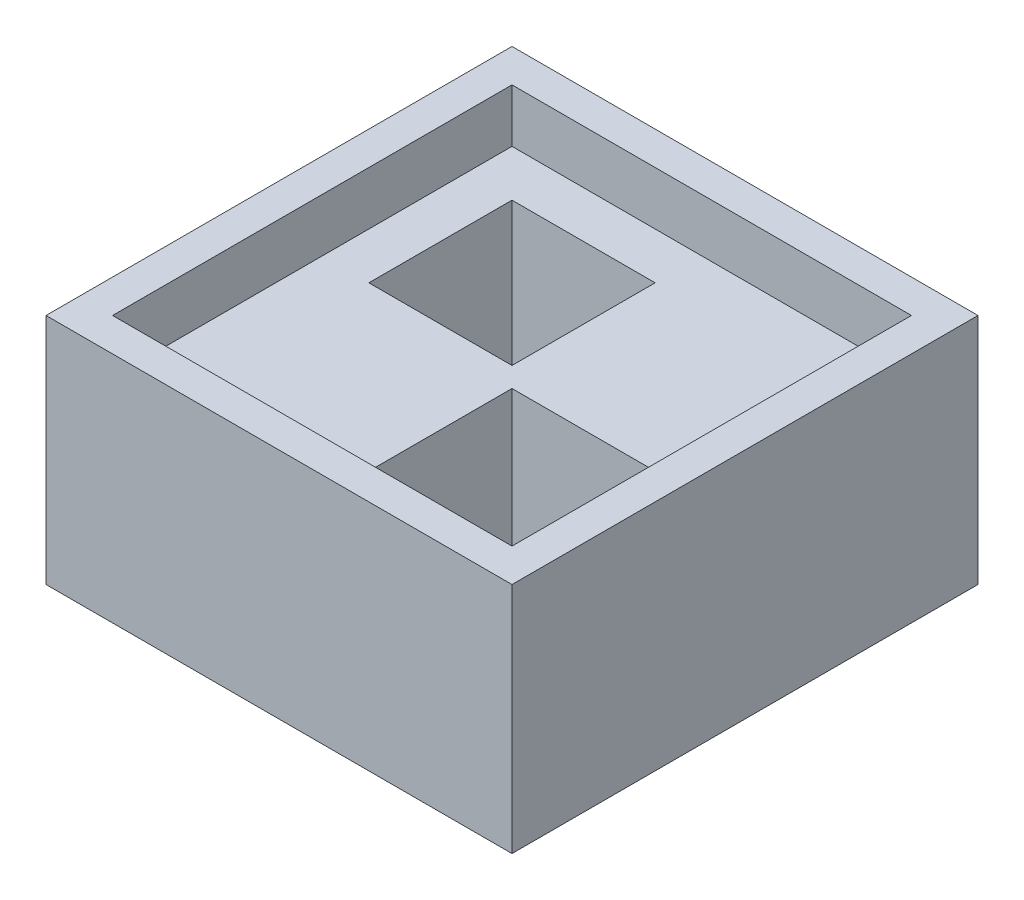
ISO-10303-21;
HEADER;
FILE_DESCRIPTION(('STEP AP214'),'2;1');
FILE_NAME('part.step','',(''),(''),'','','');
FILE_SCHEMA(('AUTOMOTIVE_DESIGN { 1 0 10303 214 1 1 1 1 }'));
ENDSEC;
DATA;
#1=APPLICATION_CONTEXT('core data for automotive mechanical design processes');
#2=APPLICATION_PROTOCOL_DEFINITION('international standard','automotive_design',2000,#1);
#3=PRODUCT_CONTEXT('',#1,'mechanical');
#4=PRODUCT('Part','Part','',(#3));
#5=PRODUCT_RELATED_PRODUCT_CATEGORY('part','',(#4));
#6=PRODUCT_DEFINITION_FORMATION('','',#4);
#7=PRODUCT_DEFINITION_CONTEXT('part definition',#1,'design');
#8=PRODUCT_DEFINITION('design','',#6,#7);
#9=PRODUCT_DEFINITION_SHAPE('','',#8);
#10=(LENGTH_UNIT() NAMED_UNIT(*) SI_UNIT(.MILLI.,.METRE.));
#11=(NAMED_UNIT(*) PLANE_ANGLE_UNIT() SI_UNIT($,.RADIAN.));
#12=(NAMED_UNIT(*) SI_UNIT($,.STERADIAN.) SOLID_ANGLE_UNIT());
#13=UNCERTAINTY_MEASURE_WITH_UNIT(LENGTH_MEASURE(1.E-05),#10,'distance_accuracy_value','');
#14=(GEOMETRIC_REPRESENTATION_CONTEXT(3) GLOBAL_UNCERTAINTY_ASSIGNED_CONTEXT((#13)) GLOBAL_UNIT_ASSIGNED_CONTEXT((#10,
#11,#12)) REPRESENTATION_CONTEXT('',''));
#15=CARTESIAN_POINT('',(0.,0.,0.));
#16=DIRECTION('',(0.,0.,1.));
#17=DIRECTION('',(1.,0.,0.));
#18=AXIS2_PLACEMENT_3D('',#15,#16,#17);
#19=CARTESIAN_POINT('',(0.,35.,0.));
#20=DIRECTION('',(1.,0.,0.));
#21=DIRECTION('',(0.,0.,-1.));
#22=AXIS2_PLACEMENT_3D('',#19,#20,#21);
#23=PLANE('',#22);
#24=DIRECTION('',(0.,0.,1.));
#25=VECTOR('',#24,1.);
#26=CARTESIAN_POINT('',(0.,0.,0.));
#27=LINE('',#26,#25);
#28=CARTESIAN_POINT('',(0.,0.,-70.));
#29=VERTEX_POINT('',#28);
#30=CARTESIAN_POINT('',(0.,0.,0.));
#31=VERTEX_POINT('',#30);
#32=EDGE_CURVE('E239',#29,#31,#27,.T.);
#33=ORIENTED_EDGE('',*,*,#32,.T.);
#34=DIRECTION('',(0.,-1.,0.));
#35=VECTOR('',#34,1.);
#36=CARTESIAN_POINT('',(0.,35.,0.));
#37=LINE('',#36,#35);
#38=CARTESIAN_POINT('',(0.,35.,0.));
#39=VERTEX_POINT('',#38);
#40=EDGE_CURVE('E11',#39,#31,#37,.T.);
#41=ORIENTED_EDGE('',*,*,#40,.F.);
#42=DIRECTION('',(0.,0.,1.));
#43=VECTOR('',#42,1.);
#44=CARTESIAN_POINT('',(0.,35.,0.));
#45=LINE('',#44,#43);
#46=CARTESIAN_POINT('',(0.,35.,-70.));
#47=VERTEX_POINT('',#46);
#48=EDGE_CURVE('E246',#47,#39,#45,.T.);
#49=ORIENTED_EDGE('',*,*,#48,.F.);
#50=DIRECTION('',(0.,-1.,0.));
#51=VECTOR('',#50,1.);
#52=CARTESIAN_POINT('',(0.,35.,-70.));
#53=LINE('',#52,#51);
#54=EDGE_CURVE('E256',#47,#29,#53,.T.);
#55=ORIENTED_EDGE('',*,*,#54,.T.);
#56=EDGE_LOOP('',(#33,#41,#49,#55));
#57=FACE_BOUND('',#56,.T.);
#58=ADVANCED_FACE('F33',(#57),#23,.F.);
#59=CARTESIAN_POINT('',(0.,35.,0.));
#60=DIRECTION('',(0.,0.,-1.));
#61=DIRECTION('',(-1.,0.,0.));
#62=AXIS2_PLACEMENT_3D('',#59,#60,#61);
#63=PLANE('',#62);
#64=DIRECTION('',(1.,0.,0.));
#65=VECTOR('',#64,1.);
#66=CARTESIAN_POINT('',(0.,0.,0.));
#67=LINE('',#66,#65);
#68=CARTESIAN_POINT('',(70.,0.,0.));
#69=VERTEX_POINT('',#68);
#70=EDGE_CURVE('E259',#31,#69,#67,.T.);
#71=ORIENTED_EDGE('',*,*,#70,.T.);
#72=DIRECTION('',(0.,-1.,0.));
#73=VECTOR('',#72,1.);
#74=CARTESIAN_POINT('',(70.,35.,0.));
#75=LINE('',#74,#73);
#76=CARTESIAN_POINT('',(70.,35.,0.));
#77=VERTEX_POINT('',#76);
#78=EDGE_CURVE('E40',#77,#69,#75,.T.);
#79=ORIENTED_EDGE('',*,*,#78,.F.);
#80=DIRECTION('',(1.,0.,0.));
#81=VECTOR('',#80,1.);
#82=CARTESIAN_POINT('',(0.,35.,0.));
#83=LINE('',#82,#81);
#84=EDGE_CURVE('E249',#39,#77,#83,.T.);
#85=ORIENTED_EDGE('',*,*,#84,.F.);
#86=ORIENTED_EDGE('',*,*,#40,.T.);
#87=EDGE_LOOP('',(#71,#79,#85,#86));
#88=FACE_BOUND('',#87,.T.);
#89=ADVANCED_FACE('F289',(#88),#63,.F.);
#90=CARTESIAN_POINT('',(70.,35.,0.));
#91=DIRECTION('',(-1.,0.,0.));
#92=DIRECTION('',(0.,0.,1.));
#93=AXIS2_PLACEMENT_3D('',#90,#91,#92);
#94=PLANE('',#93);
#95=DIRECTION('',(0.,0.,-1.));
#96=VECTOR('',#95,1.);
#97=CARTESIAN_POINT('',(70.,0.,0.));
#98=LINE('',#97,#96);
#99=CARTESIAN_POINT('',(70.,0.,-70.));
#100=VERTEX_POINT('',#99);
#101=EDGE_CURVE('E261',#69,#100,#98,.T.);
#102=ORIENTED_EDGE('',*,*,#101,.T.);
#103=DIRECTION('',(0.,-1.,0.));
#104=VECTOR('',#103,1.);
#105=CARTESIAN_POINT('',(70.,35.,-70.));
#106=LINE('',#105,#104);
#107=CARTESIAN_POINT('',(70.,35.,-70.));
#108=VERTEX_POINT('',#107);
#109=EDGE_CURVE('E266',#108,#100,#106,.T.);
#110=ORIENTED_EDGE('',*,*,#109,.F.);
#111=DIRECTION('',(0.,0.,-1.));
#112=VECTOR('',#111,1.);
#113=CARTESIAN_POINT('',(70.,35.,0.));
#114=LINE('',#113,#112);
#115=EDGE_CURVE('E252',#77,#108,#114,.T.);
#116=ORIENTED_EDGE('',*,*,#115,.F.);
#117=ORIENTED_EDGE('',*,*,#78,.T.);
#118=EDGE_LOOP('',(#102,#110,#116,#117));
#119=FACE_BOUND('',#118,.T.);
#120=ADVANCED_FACE('F273',(#119),#94,.F.);
#121=CARTESIAN_POINT('',(0.,35.,-70.));
#122=DIRECTION('',(0.,0.,1.));
#123=DIRECTION('',(1.,0.,0.));
#124=AXIS2_PLACEMENT_3D('',#121,#122,#123);
#125=PLANE('',#124);
#126=DIRECTION('',(-1.,0.,0.));
#127=VECTOR('',#126,1.);
#128=CARTESIAN_POINT('',(0.,0.,-70.));
#129=LINE('',#128,#127);
#130=EDGE_CURVE('E250',#100,#29,#129,.T.);
#131=ORIENTED_EDGE('',*,*,#130,.T.);
#132=ORIENTED_EDGE('',*,*,#54,.F.);
#133=DIRECTION('',(-1.,0.,0.));
#134=VECTOR('',#133,1.);
#135=CARTESIAN_POINT('',(0.,35.,-70.));
#136=LINE('',#135,#134);
#137=EDGE_CURVE('E254',#108,#47,#136,.T.);
#138=ORIENTED_EDGE('',*,*,#137,.F.);
#139=ORIENTED_EDGE('',*,*,#109,.T.);
#140=EDGE_LOOP('',(#131,#132,#138,#139));
#141=FACE_BOUND('',#140,.T.);
#142=ADVANCED_FACE('F282',(#141),#125,.F.);
#143=CARTESIAN_POINT('',(0.,35.,0.));
#144=DIRECTION('',(0.,-1.,0.));
#145=DIRECTION('',(0.,0.,-1.));
#146=AXIS2_PLACEMENT_3D('',#143,#144,#145);
#147=PLANE('',#146);
#148=DIRECTION('',(1.,0.,0.));
#149=VECTOR('',#148,1.);
#150=CARTESIAN_POINT('',(5.,35.,-5.));
#151=LINE('',#150,#149);
#152=CARTESIAN_POINT('',(5.,35.,-5.));
#153=VERTEX_POINT('',#152);
#154=CARTESIAN_POINT('',(65.,35.,-5.));
#155=VERTEX_POINT('',#154);
#156=EDGE_CURVE('E229',#153,#155,#151,.T.);
#157=ORIENTED_EDGE('',*,*,#156,.F.);
#158=DIRECTION('',(0.,0.,1.));
#159=VECTOR('',#158,1.);
#160=CARTESIAN_POINT('',(5.,35.,-5.));
#161=LINE('',#160,#159);
#162=CARTESIAN_POINT('',(5.,35.,-65.));
#163=VERTEX_POINT('',#162);
#164=EDGE_CURVE('E181',#163,#153,#161,.T.);
#165=ORIENTED_EDGE('',*,*,#164,.F.);
#166=DIRECTION('',(-1.,0.,0.));
#167=VECTOR('',#166,1.);
#168=CARTESIAN_POINT('',(5.,35.,-65.));
#169=LINE('',#168,#167);
#170=CARTESIAN_POINT('',(65.,35.,-65.));
#171=VERTEX_POINT('',#170);
#172=EDGE_CURVE('E218',#171,#163,#169,.T.);
#173=ORIENTED_EDGE('',*,*,#172,.F.);
#174=DIRECTION('',(0.,0.,-1.));
#175=VECTOR('',#174,1.);
#176=CARTESIAN_POINT('',(65.,35.,-5.));
#177=LINE('',#176,#175);
#178=EDGE_CURVE('E232',#155,#171,#177,.T.);
#179=ORIENTED_EDGE('',*,*,#178,.F.);
#180=EDGE_LOOP('',(#157,#165,#173,#179));
#181=FACE_BOUND('',#180,.T.);
#182=ORIENTED_EDGE('',*,*,#48,.T.);
#183=ORIENTED_EDGE('',*,*,#84,.T.);
#184=ORIENTED_EDGE('',*,*,#115,.T.);
#185=ORIENTED_EDGE('',*,*,#137,.T.);
#186=EDGE_LOOP('',(#182,#183,#184,#185));
#187=FACE_BOUND('',#186,.T.);
#188=ADVANCED_FACE('F288',(#181,#187),#147,.F.);
#189=CARTESIAN_POINT('',(0.,0.,0.));
#190=DIRECTION('',(0.,-1.,0.));
#191=DIRECTION('',(0.,0.,-1.));
#192=AXIS2_PLACEMENT_3D('',#189,#190,#191);
#193=PLANE('',#192);
#194=ORIENTED_EDGE('',*,*,#32,.F.);
#195=ORIENTED_EDGE('',*,*,#130,.F.);
#196=ORIENTED_EDGE('',*,*,#101,.F.);
#197=ORIENTED_EDGE('',*,*,#70,.F.);
#198=EDGE_LOOP('',(#194,#195,#196,#197));
#199=FACE_BOUND('',#198,.T.);
#200=ADVANCED_FACE('F279',(#199),#193,.T.);
#201=CARTESIAN_POINT('',(5.,27.,-5.));
#202=DIRECTION('',(-1.,0.,0.));
#203=DIRECTION('',(0.,0.,1.));
#204=AXIS2_PLACEMENT_3D('',#201,#202,#203);
#205=PLANE('',#204);
#206=ORIENTED_EDGE('',*,*,#164,.T.);
#207=DIRECTION('',(0.,1.,0.));
#208=VECTOR('',#207,1.);
#209=CARTESIAN_POINT('',(5.,27.,-5.));
#210=LINE('',#209,#208);
#211=CARTESIAN_POINT('',(5.,27.,-5.));
#212=VERTEX_POINT('',#211);
#213=EDGE_CURVE('E227',#212,#153,#210,.T.);
#214=ORIENTED_EDGE('',*,*,#213,.F.);
#215=DIRECTION('',(0.,0.,1.));
#216=VECTOR('',#215,1.);
#217=CARTESIAN_POINT('',(5.,27.,-5.));
#218=LINE('',#217,#216);
#219=CARTESIAN_POINT('',(5.,27.,-65.));
#220=VERTEX_POINT('',#219);
#221=EDGE_CURVE('E214',#220,#212,#218,.T.);
#222=ORIENTED_EDGE('',*,*,#221,.F.);
#223=DIRECTION('',(0.,1.,0.));
#224=VECTOR('',#223,1.);
#225=CARTESIAN_POINT('',(5.,27.,-65.));
#226=LINE('',#225,#224);
#227=EDGE_CURVE('E237',#220,#163,#226,.T.);
#228=ORIENTED_EDGE('',*,*,#227,.T.);
#229=EDGE_LOOP('',(#206,#214,#222,#228));
#230=FACE_BOUND('',#229,.T.);
#231=ADVANCED_FACE('F301',(#230),#205,.F.);
#232=CARTESIAN_POINT('',(5.,27.,-65.));
#233=DIRECTION('',(0.,0.,-1.));
#234=DIRECTION('',(-1.,0.,0.));
#235=AXIS2_PLACEMENT_3D('',#232,#233,#234);
#236=PLANE('',#235);
#237=ORIENTED_EDGE('',*,*,#172,.T.);
#238=ORIENTED_EDGE('',*,*,#227,.F.);
#239=DIRECTION('',(-1.,0.,0.));
#240=VECTOR('',#239,1.);
#241=CARTESIAN_POINT('',(5.,27.,-65.));
#242=LINE('',#241,#240);
#243=CARTESIAN_POINT('',(65.,27.,-65.));
#244=VERTEX_POINT('',#243);
#245=EDGE_CURVE('E224',#244,#220,#242,.T.);
#246=ORIENTED_EDGE('',*,*,#245,.F.);
#247=DIRECTION('',(0.,1.,0.));
#248=VECTOR('',#247,1.);
#249=CARTESIAN_POINT('',(65.,27.,-65.));
#250=LINE('',#249,#248);
#251=EDGE_CURVE('E240',#244,#171,#250,.T.);
#252=ORIENTED_EDGE('',*,*,#251,.T.);
#253=EDGE_LOOP('',(#237,#238,#246,#252));
#254=FACE_BOUND('',#253,.T.);
#255=ADVANCED_FACE('F307',(#254),#236,.F.);
#256=CARTESIAN_POINT('',(65.,27.,-5.));
#257=DIRECTION('',(1.,0.,0.));
#258=DIRECTION('',(0.,0.,-1.));
#259=AXIS2_PLACEMENT_3D('',#256,#257,#258);
#260=PLANE('',#259);
#261=ORIENTED_EDGE('',*,*,#178,.T.);
#262=ORIENTED_EDGE('',*,*,#251,.F.);
#263=DIRECTION('',(0.,0.,-1.));
#264=VECTOR('',#263,1.);
#265=CARTESIAN_POINT('',(65.,27.,-5.));
#266=LINE('',#265,#264);
#267=CARTESIAN_POINT('',(65.,27.,-5.));
#268=VERTEX_POINT('',#267);
#269=EDGE_CURVE('E221',#268,#244,#266,.T.);
#270=ORIENTED_EDGE('',*,*,#269,.F.);
#271=DIRECTION('',(0.,1.,0.));
#272=VECTOR('',#271,1.);
#273=CARTESIAN_POINT('',(65.,27.,-5.));
#274=LINE('',#273,#272);
#275=EDGE_CURVE('E242',#268,#155,#274,.T.);
#276=ORIENTED_EDGE('',*,*,#275,.T.);
#277=EDGE_LOOP('',(#261,#262,#270,#276));
#278=FACE_BOUND('',#277,.T.);
#279=ADVANCED_FACE('F313',(#278),#260,.F.);
#280=CARTESIAN_POINT('',(5.,27.,-5.));
#281=DIRECTION('',(0.,0.,1.));
#282=DIRECTION('',(1.,0.,0.));
#283=AXIS2_PLACEMENT_3D('',#280,#281,#282);
#284=PLANE('',#283);
#285=ORIENTED_EDGE('',*,*,#156,.T.);
#286=ORIENTED_EDGE('',*,*,#275,.F.);
#287=DIRECTION('',(1.,0.,0.));
#288=VECTOR('',#287,1.);
#289=CARTESIAN_POINT('',(5.,27.,-5.));
#290=LINE('',#289,#288);
#291=EDGE_CURVE('E217',#212,#268,#290,.T.);
#292=ORIENTED_EDGE('',*,*,#291,.F.);
#293=ORIENTED_EDGE('',*,*,#213,.T.);
#294=EDGE_LOOP('',(#285,#286,#292,#293));
#295=FACE_BOUND('',#294,.T.);
#296=ADVANCED_FACE('F309',(#295),#284,.F.);
#297=CARTESIAN_POINT('',(0.,27.,0.));
#298=DIRECTION('',(0.,-1.,0.));
#299=DIRECTION('',(0.,0.,-1.));
#300=AXIS2_PLACEMENT_3D('',#297,#298,#299);
#301=PLANE('',#300);
#302=DIRECTION('',(1.,0.,0.));
#303=VECTOR('',#302,1.);
#304=CARTESIAN_POINT('',(12.,27.,-36.5));
#305=LINE('',#304,#303);
#306=CARTESIAN_POINT('',(12.,27.,-36.5));
#307=VERTEX_POINT('',#306);
#308=CARTESIAN_POINT('',(33.5,27.,-36.5));
#309=VERTEX_POINT('',#308);
#310=EDGE_CURVE('E174',#307,#309,#305,.T.);
#311=ORIENTED_EDGE('',*,*,#310,.F.);
#312=DIRECTION('',(0.,0.,1.));
#313=VECTOR('',#312,1.);
#314=CARTESIAN_POINT('',(12.,27.,-58.));
#315=LINE('',#314,#313);
#316=CARTESIAN_POINT('',(12.,27.,-58.));
#317=VERTEX_POINT('',#316);
#318=EDGE_CURVE('E47',#317,#307,#315,.T.);
#319=ORIENTED_EDGE('',*,*,#318,.F.);
#320=DIRECTION('',(-1.,0.,0.));
#321=VECTOR('',#320,1.);
#322=CARTESIAN_POINT('',(12.,27.,-58.));
#323=LINE('',#322,#321);
#324=CARTESIAN_POINT('',(33.5,27.,-58.));
#325=VERTEX_POINT('',#324);
#326=EDGE_CURVE('E165',#325,#317,#323,.T.);
#327=ORIENTED_EDGE('',*,*,#326,.F.);
#328=DIRECTION('',(0.,0.,-1.));
#329=VECTOR('',#328,1.);
#330=CARTESIAN_POINT('',(33.5,27.,-58.));
#331=LINE('',#330,#329);
#332=EDGE_CURVE('E168',#309,#325,#331,.T.);
#333=ORIENTED_EDGE('',*,*,#332,.F.);
#334=EDGE_LOOP('',(#311,#319,#327,#333));
#335=FACE_BOUND('',#334,.T.);
#336=DIRECTION('',(-1.,0.,0.));
#337=VECTOR('',#336,1.);
#338=CARTESIAN_POINT('',(58.,27.,-33.5));
#339=LINE('',#338,#337);
#340=CARTESIAN_POINT('',(58.,27.,-33.5));
#341=VERTEX_POINT('',#340);
#342=CARTESIAN_POINT('',(36.5,27.,-33.5));
#343=VERTEX_POINT('',#342);
#344=EDGE_CURVE('E200',#341,#343,#339,.T.);
#345=ORIENTED_EDGE('',*,*,#344,.F.);
#346=DIRECTION('',(0.,0.,-1.));
#347=VECTOR('',#346,1.);
#348=CARTESIAN_POINT('',(58.,27.,-12.));
#349=LINE('',#348,#347);
#350=CARTESIAN_POINT('',(58.,27.,-12.));
#351=VERTEX_POINT('',#350);
#352=EDGE_CURVE('E55',#351,#341,#349,.T.);
#353=ORIENTED_EDGE('',*,*,#352,.F.);
#354=DIRECTION('',(1.,0.,0.));
#355=VECTOR('',#354,1.);
#356=CARTESIAN_POINT('',(58.,27.,-12.));
#357=LINE('',#356,#355);
#358=CARTESIAN_POINT('',(36.5,27.,-12.));
#359=VERTEX_POINT('',#358);
#360=EDGE_CURVE('E189',#359,#351,#357,.T.);
#361=ORIENTED_EDGE('',*,*,#360,.F.);
#362=DIRECTION('',(0.,0.,1.));
#363=VECTOR('',#362,1.);
#364=CARTESIAN_POINT('',(36.5,27.,-12.));
#365=LINE('',#364,#363);
#366=EDGE_CURVE('E203',#343,#359,#365,.T.);
#367=ORIENTED_EDGE('',*,*,#366,.F.);
#368=EDGE_LOOP('',(#345,#353,#361,#367));
#369=FACE_BOUND('',#368,.T.);
#370=ORIENTED_EDGE('',*,*,#221,.T.);
#371=ORIENTED_EDGE('',*,*,#291,.T.);
#372=ORIENTED_EDGE('',*,*,#269,.T.);
#373=ORIENTED_EDGE('',*,*,#245,.T.);
#374=EDGE_LOOP('',(#370,#371,#372,#373));
#375=FACE_BOUND('',#374,.T.);
#376=ADVANCED_FACE('F312',(#335,#369,#375),#301,.F.);
#377=CARTESIAN_POINT('',(58.,1.5,-12.));
#378=DIRECTION('',(1.,0.,0.));
#379=DIRECTION('',(0.,0.,-1.));
#380=AXIS2_PLACEMENT_3D('',#377,#378,#379);
#381=PLANE('',#380);
#382=ORIENTED_EDGE('',*,*,#352,.T.);
#383=DIRECTION('',(0.,1.,0.));
#384=VECTOR('',#383,1.);
#385=CARTESIAN_POINT('',(58.,1.5,-33.5));
#386=LINE('',#385,#384);
#387=CARTESIAN_POINT('',(58.,1.5,-33.5));
#388=VERTEX_POINT('',#387);
#389=EDGE_CURVE('E198',#388,#341,#386,.T.);
#390=ORIENTED_EDGE('',*,*,#389,.F.);
#391=DIRECTION('',(0.,0.,-1.));
#392=VECTOR('',#391,1.);
#393=CARTESIAN_POINT('',(58.,1.5,-12.));
#394=LINE('',#393,#392);
#395=CARTESIAN_POINT('',(58.,1.5,-12.));
#396=VERTEX_POINT('',#395);
#397=EDGE_CURVE('E185',#396,#388,#394,.T.);
#398=ORIENTED_EDGE('',*,*,#397,.F.);
#399=DIRECTION('',(0.,1.,0.));
#400=VECTOR('',#399,1.);
#401=CARTESIAN_POINT('',(58.,1.5,-12.));
#402=LINE('',#401,#400);
#403=EDGE_CURVE('E175',#396,#351,#402,.T.);
#404=ORIENTED_EDGE('',*,*,#403,.T.);
#405=EDGE_LOOP('',(#382,#390,#398,#404));
#406=FACE_BOUND('',#405,.T.);
#407=ADVANCED_FACE('F323',(#406),#381,.F.);
#408=CARTESIAN_POINT('',(58.,1.5,-12.));
#409=DIRECTION('',(0.,0.,1.));
#410=DIRECTION('',(1.,0.,0.));
#411=AXIS2_PLACEMENT_3D('',#408,#409,#410);
#412=PLANE('',#411);
#413=ORIENTED_EDGE('',*,*,#360,.T.);
#414=ORIENTED_EDGE('',*,*,#403,.F.);
#415=DIRECTION('',(1.,0.,0.));
#416=VECTOR('',#415,1.);
#417=CARTESIAN_POINT('',(58.,1.5,-12.));
#418=LINE('',#417,#416);
#419=CARTESIAN_POINT('',(36.5,1.5,-12.));
#420=VERTEX_POINT('',#419);
#421=EDGE_CURVE('E195',#420,#396,#418,.T.);
#422=ORIENTED_EDGE('',*,*,#421,.F.);
#423=DIRECTION('',(0.,1.,0.));
#424=VECTOR('',#423,1.);
#425=CARTESIAN_POINT('',(36.5,1.5,-12.));
#426=LINE('',#425,#424);
#427=EDGE_CURVE('E209',#420,#359,#426,.T.);
#428=ORIENTED_EDGE('',*,*,#427,.T.);
#429=EDGE_LOOP('',(#413,#414,#422,#428));
#430=FACE_BOUND('',#429,.T.);
#431=ADVANCED_FACE('F327',(#430),#412,.F.);
#432=CARTESIAN_POINT('',(36.5,1.5,-12.));
#433=DIRECTION('',(-1.,0.,0.));
#434=DIRECTION('',(0.,0.,1.));
#435=AXIS2_PLACEMENT_3D('',#432,#433,#434);
#436=PLANE('',#435);
#437=ORIENTED_EDGE('',*,*,#366,.T.);
#438=ORIENTED_EDGE('',*,*,#427,.F.);
#439=DIRECTION('',(0.,0.,1.));
#440=VECTOR('',#439,1.);
#441=CARTESIAN_POINT('',(36.5,1.5,-12.));
#442=LINE('',#441,#440);
#443=CARTESIAN_POINT('',(36.5,1.5,-33.5));
#444=VERTEX_POINT('',#443);
#445=EDGE_CURVE('E192',#444,#420,#442,.T.);
#446=ORIENTED_EDGE('',*,*,#445,.F.);
#447=DIRECTION('',(0.,1.,0.));
#448=VECTOR('',#447,1.);
#449=CARTESIAN_POINT('',(36.5,1.5,-33.5));
#450=LINE('',#449,#448);
#451=EDGE_CURVE('E211',#444,#343,#450,.T.);
#452=ORIENTED_EDGE('',*,*,#451,.T.);
#453=EDGE_LOOP('',(#437,#438,#446,#452));
#454=FACE_BOUND('',#453,.T.);
#455=ADVANCED_FACE('F332',(#454),#436,.F.);
#456=CARTESIAN_POINT('',(58.,1.5,-33.5));
#457=DIRECTION('',(0.,0.,-1.));
#458=DIRECTION('',(-1.,0.,0.));
#459=AXIS2_PLACEMENT_3D('',#456,#457,#458);
#460=PLANE('',#459);
#461=ORIENTED_EDGE('',*,*,#344,.T.);
#462=ORIENTED_EDGE('',*,*,#451,.F.);
#463=DIRECTION('',(-1.,0.,0.));
#464=VECTOR('',#463,1.);
#465=CARTESIAN_POINT('',(58.,1.5,-33.5));
#466=LINE('',#465,#464);
#467=EDGE_CURVE('E188',#388,#444,#466,.T.);
#468=ORIENTED_EDGE('',*,*,#467,.F.);
#469=ORIENTED_EDGE('',*,*,#389,.T.);
#470=EDGE_LOOP('',(#461,#462,#468,#469));
#471=FACE_BOUND('',#470,.T.);
#472=ADVANCED_FACE('F328',(#471),#460,.F.);
#473=CARTESIAN_POINT('',(0.,1.5,0.));
#474=DIRECTION('',(0.,1.,0.));
#475=DIRECTION('',(0.,0.,1.));
#476=AXIS2_PLACEMENT_3D('',#473,#474,#475);
#477=PLANE('',#476);
#478=ORIENTED_EDGE('',*,*,#397,.T.);
#479=ORIENTED_EDGE('',*,*,#467,.T.);
#480=ORIENTED_EDGE('',*,*,#445,.T.);
#481=ORIENTED_EDGE('',*,*,#421,.T.);
#482=EDGE_LOOP('',(#478,#479,#480,#481));
#483=FACE_BOUND('',#482,.T.);
#484=ADVANCED_FACE('F331',(#483),#477,.T.);
#485=CARTESIAN_POINT('',(12.,1.5,-58.));
#486=DIRECTION('',(-1.,0.,0.));
#487=DIRECTION('',(0.,0.,1.));
#488=AXIS2_PLACEMENT_3D('',#485,#486,#487);
#489=PLANE('',#488);
#490=ORIENTED_EDGE('',*,*,#318,.T.);
#491=DIRECTION('',(0.,1.,0.));
#492=VECTOR('',#491,1.);
#493=CARTESIAN_POINT('',(12.,1.5,-36.5));
#494=LINE('',#493,#492);
#495=CARTESIAN_POINT('',(12.,1.5,-36.5));
#496=VERTEX_POINT('',#495);
#497=EDGE_CURVE('E143',#496,#307,#494,.T.);
#498=ORIENTED_EDGE('',*,*,#497,.F.);
#499=DIRECTION('',(0.,0.,1.));
#500=VECTOR('',#499,1.);
#501=CARTESIAN_POINT('',(12.,1.5,-58.));
#502=LINE('',#501,#500);
#503=CARTESIAN_POINT('',(12.,1.5,-58.));
#504=VERTEX_POINT('',#503);
#505=EDGE_CURVE('E147',#504,#496,#502,.T.);
#506=ORIENTED_EDGE('',*,*,#505,.F.);
#507=DIRECTION('',(0.,1.,0.));
#508=VECTOR('',#507,1.);
#509=CARTESIAN_POINT('',(12.,1.5,-58.));
#510=LINE('',#509,#508);
#511=EDGE_CURVE('E179',#504,#317,#510,.T.);
#512=ORIENTED_EDGE('',*,*,#511,.T.);
#513=EDGE_LOOP('',(#490,#498,#506,#512));
#514=FACE_BOUND('',#513,.T.);
#515=ADVANCED_FACE('F145',(#514),#489,.F.);
#516=CARTESIAN_POINT('',(12.,1.5,-58.));
#517=DIRECTION('',(0.,0.,-1.));
#518=DIRECTION('',(-1.,0.,0.));
#519=AXIS2_PLACEMENT_3D('',#516,#517,#518);
#520=PLANE('',#519);
#521=ORIENTED_EDGE('',*,*,#326,.T.);
#522=ORIENTED_EDGE('',*,*,#511,.F.);
#523=DIRECTION('',(-1.,0.,0.));
#524=VECTOR('',#523,1.);
#525=CARTESIAN_POINT('',(12.,1.5,-58.));
#526=LINE('',#525,#524);
#527=CARTESIAN_POINT('',(33.5,1.5,-58.));
#528=VERTEX_POINT('',#527);
#529=EDGE_CURVE('E153',#528,#504,#526,.T.);
#530=ORIENTED_EDGE('',*,*,#529,.F.);
#531=DIRECTION('',(0.,1.,0.));
#532=VECTOR('',#531,1.);
#533=CARTESIAN_POINT('',(33.5,1.5,-58.));
#534=LINE('',#533,#532);
#535=EDGE_CURVE('E182',#528,#325,#534,.T.);
#536=ORIENTED_EDGE('',*,*,#535,.T.);
#537=EDGE_LOOP('',(#521,#522,#530,#536));
#538=FACE_BOUND('',#537,.T.);
#539=ADVANCED_FACE('F345',(#538),#520,.F.);
#540=CARTESIAN_POINT('',(33.5,1.5,-58.));
#541=DIRECTION('',(1.,0.,0.));
#542=DIRECTION('',(0.,0.,-1.));
#543=AXIS2_PLACEMENT_3D('',#540,#541,#542);
#544=PLANE('',#543);
#545=ORIENTED_EDGE('',*,*,#332,.T.);
#546=ORIENTED_EDGE('',*,*,#535,.F.);
#547=DIRECTION('',(0.,0.,-1.));
#548=VECTOR('',#547,1.);
#549=CARTESIAN_POINT('',(33.5,1.5,-58.));
#550=LINE('',#549,#548);
#551=CARTESIAN_POINT('',(33.5,1.5,-36.5));
#552=VERTEX_POINT('',#551);
#553=EDGE_CURVE('E161',#552,#528,#550,.T.);
#554=ORIENTED_EDGE('',*,*,#553,.F.);
#555=DIRECTION('',(0.,1.,0.));
#556=VECTOR('',#555,1.);
#557=CARTESIAN_POINT('',(33.5,1.5,-36.5));
#558=LINE('',#557,#556);
#559=EDGE_CURVE('E152',#552,#309,#558,.T.);
#560=ORIENTED_EDGE('',*,*,#559,.T.);
#561=EDGE_LOOP('',(#545,#546,#554,#560));
#562=FACE_BOUND('',#561,.T.);
#563=ADVANCED_FACE('F348',(#562),#544,.F.);
#564=CARTESIAN_POINT('',(12.,1.5,-36.5));
#565=DIRECTION('',(0.,0.,1.));
#566=DIRECTION('',(1.,0.,0.));
#567=AXIS2_PLACEMENT_3D('',#564,#565,#566);
#568=PLANE('',#567);
#569=ORIENTED_EDGE('',*,*,#310,.T.);
#570=ORIENTED_EDGE('',*,*,#559,.F.);
#571=DIRECTION('',(1.,0.,0.));
#572=VECTOR('',#571,1.);
#573=CARTESIAN_POINT('',(12.,1.5,-36.5));
#574=LINE('',#573,#572);
#575=EDGE_CURVE('E156',#496,#552,#574,.T.);
#576=ORIENTED_EDGE('',*,*,#575,.F.);
#577=ORIENTED_EDGE('',*,*,#497,.T.);
#578=EDGE_LOOP('',(#569,#570,#576,#577));
#579=FACE_BOUND('',#578,.T.);
#580=ADVANCED_FACE('F157',(#579),#568,.F.);
#581=CARTESIAN_POINT('',(0.,1.5,0.));
#582=DIRECTION('',(0.,1.,0.));
#583=DIRECTION('',(0.,0.,1.));
#584=AXIS2_PLACEMENT_3D('',#581,#582,#583);
#585=PLANE('',#584);
#586=ORIENTED_EDGE('',*,*,#505,.T.);
#587=ORIENTED_EDGE('',*,*,#575,.T.);
#588=ORIENTED_EDGE('',*,*,#553,.T.);
#589=ORIENTED_EDGE('',*,*,#529,.T.);
#590=EDGE_LOOP('',(#586,#587,#588,#589));
#591=FACE_BOUND('',#590,.T.);
#592=ADVANCED_FACE('F163',(#591),#585,.T.);
#593=CLOSED_SHELL('',(#58,#89,#120,#142,#188,#200,#231,#255,#279,#296,#376,#407,#431,#455,#472,
#484,#515,#539,#563,#580,#592));
#594=MANIFOLD_SOLID_BREP('B2',#593);
#595=ADVANCED_BREP_SHAPE_REPRESENTATION('',(#18,#594),#14);
#596=SHAPE_DEFINITION_REPRESENTATION(#9,#595);
ENDSEC;
END-ISO-10303-21;
